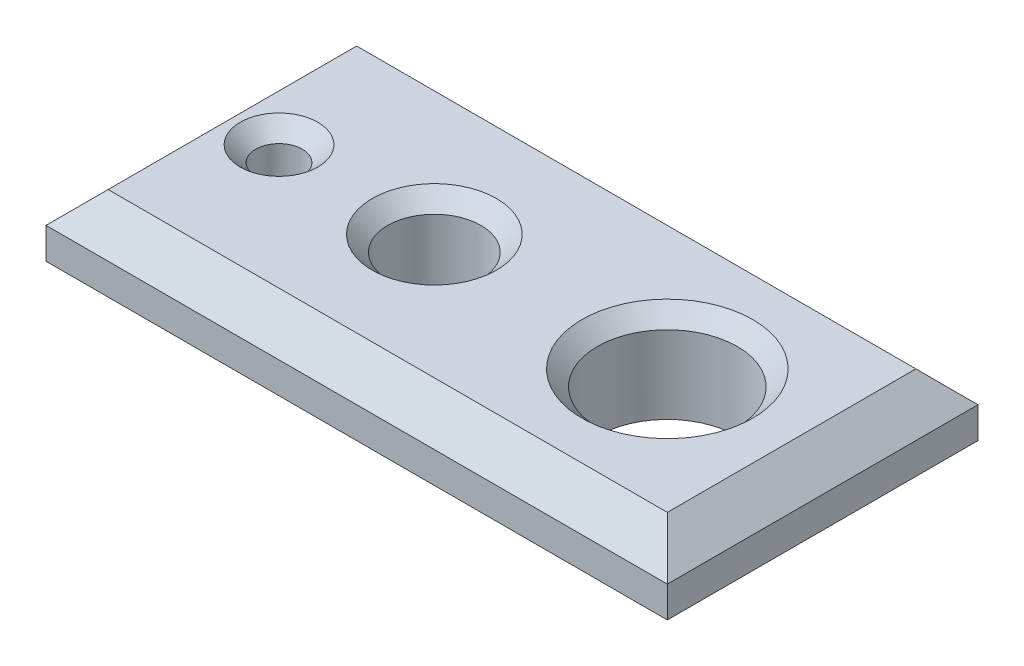
ISO-10303-21;
HEADER;
FILE_DESCRIPTION(('STEP AP214'),'2;1');
FILE_NAME('part.step','',(''),(''),'','','');
FILE_SCHEMA(('AUTOMOTIVE_DESIGN { 1 0 10303 214 1 1 1 1 }'));
ENDSEC;
DATA;
#1=APPLICATION_CONTEXT('core data for automotive mechanical design processes');
#2=APPLICATION_PROTOCOL_DEFINITION('international standard','automotive_design',2000,#1);
#3=PRODUCT_CONTEXT('',#1,'mechanical');
#4=PRODUCT('Part','Part','',(#3));
#5=PRODUCT_RELATED_PRODUCT_CATEGORY('part','',(#4));
#6=PRODUCT_DEFINITION_FORMATION('','',#4);
#7=PRODUCT_DEFINITION_CONTEXT('part definition',#1,'design');
#8=PRODUCT_DEFINITION('design','',#6,#7);
#9=PRODUCT_DEFINITION_SHAPE('','',#8);
#10=(LENGTH_UNIT() NAMED_UNIT(*) SI_UNIT(.MILLI.,.METRE.));
#11=(NAMED_UNIT(*) PLANE_ANGLE_UNIT() SI_UNIT($,.RADIAN.));
#12=(NAMED_UNIT(*) SI_UNIT($,.STERADIAN.) SOLID_ANGLE_UNIT());
#13=UNCERTAINTY_MEASURE_WITH_UNIT(LENGTH_MEASURE(1.E-05),#10,'distance_accuracy_value','');
#14=(GEOMETRIC_REPRESENTATION_CONTEXT(3) GLOBAL_UNCERTAINTY_ASSIGNED_CONTEXT((#13)) GLOBAL_UNIT_ASSIGNED_CONTEXT((#10,
#11,#12)) REPRESENTATION_CONTEXT('',''));
#15=CARTESIAN_POINT('',(0.,0.,0.));
#16=DIRECTION('',(0.,0.,1.));
#17=DIRECTION('',(1.,0.,0.));
#18=AXIS2_PLACEMENT_3D('',#15,#16,#17);
#19=CARTESIAN_POINT('',(0.,30.,0.));
#20=DIRECTION('',(1.,0.,0.));
#21=DIRECTION('',(0.,0.,-1.));
#22=AXIS2_PLACEMENT_3D('',#19,#20,#21);
#23=PLANE('',#22);
#24=DIRECTION('',(0.,-1.,0.));
#25=VECTOR('',#24,1.);
#26=CARTESIAN_POINT('',(0.,30.,-100.));
#27=LINE('',#26,#25);
#28=CARTESIAN_POINT('',(0.,20.,-100.));
#29=VERTEX_POINT('',#28);
#30=CARTESIAN_POINT('',(0.,10.,-100.));
#31=VERTEX_POINT('',#30);
#32=EDGE_CURVE('E134',#29,#31,#27,.T.);
#33=ORIENTED_EDGE('',*,*,#32,.T.);
#34=DIRECTION('',(0.,0.,1.));
#35=VECTOR('',#34,1.);
#36=CARTESIAN_POINT('',(0.,10.,0.));
#37=LINE('',#36,#35);
#38=CARTESIAN_POINT('',(0.,10.,0.));
#39=VERTEX_POINT('',#38);
#40=EDGE_CURVE('E154',#31,#39,#37,.T.);
#41=ORIENTED_EDGE('',*,*,#40,.T.);
#42=DIRECTION('',(0.,-1.,0.));
#43=VECTOR('',#42,1.);
#44=CARTESIAN_POINT('',(0.,30.,0.));
#45=LINE('',#44,#43);
#46=CARTESIAN_POINT('',(0.,20.,0.));
#47=VERTEX_POINT('',#46);
#48=EDGE_CURVE('E117',#47,#39,#45,.T.);
#49=ORIENTED_EDGE('',*,*,#48,.F.);
#50=DIRECTION('',(0.,0.,-1.));
#51=VECTOR('',#50,1.);
#52=CARTESIAN_POINT('',(0.,20.,0.));
#53=LINE('',#52,#51);
#54=EDGE_CURVE('E152',#47,#29,#53,.T.);
#55=ORIENTED_EDGE('',*,*,#54,.T.);
#56=EDGE_LOOP('',(#33,#41,#49,#55));
#57=FACE_BOUND('',#56,.T.);
#58=ADVANCED_FACE('F33',(#57),#23,.F.);
#59=CARTESIAN_POINT('',(0.,30.,0.));
#60=DIRECTION('',(0.,0.,-1.));
#61=DIRECTION('',(-1.,0.,0.));
#62=AXIS2_PLACEMENT_3D('',#59,#60,#61);
#63=PLANE('',#62);
#64=ORIENTED_EDGE('',*,*,#48,.T.);
#65=DIRECTION('',(1.,0.,0.));
#66=VECTOR('',#65,1.);
#67=CARTESIAN_POINT('',(200.,10.,0.));
#68=LINE('',#67,#66);
#69=CARTESIAN_POINT('',(200.,10.,0.));
#70=VERTEX_POINT('',#69);
#71=EDGE_CURVE('E116',#39,#70,#68,.T.);
#72=ORIENTED_EDGE('',*,*,#71,.T.);
#73=DIRECTION('',(0.,-1.,0.));
#74=VECTOR('',#73,1.);
#75=CARTESIAN_POINT('',(200.,30.,0.));
#76=LINE('',#75,#74);
#77=CARTESIAN_POINT('',(200.,20.,0.));
#78=VERTEX_POINT('',#77);
#79=EDGE_CURVE('E123',#78,#70,#76,.T.);
#80=ORIENTED_EDGE('',*,*,#79,.F.);
#81=DIRECTION('',(-1.,0.,0.));
#82=VECTOR('',#81,1.);
#83=CARTESIAN_POINT('',(0.,20.,0.));
#84=LINE('',#83,#82);
#85=EDGE_CURVE('E108',#78,#47,#84,.T.);
#86=ORIENTED_EDGE('',*,*,#85,.T.);
#87=EDGE_LOOP('',(#64,#72,#80,#86));
#88=FACE_BOUND('',#87,.T.);
#89=ADVANCED_FACE('F130',(#88),#63,.F.);
#90=CARTESIAN_POINT('',(200.,30.,0.));
#91=DIRECTION('',(-1.,0.,0.));
#92=DIRECTION('',(0.,0.,1.));
#93=AXIS2_PLACEMENT_3D('',#90,#91,#92);
#94=PLANE('',#93);
#95=ORIENTED_EDGE('',*,*,#79,.T.);
#96=DIRECTION('',(0.,0.,-1.));
#97=VECTOR('',#96,1.);
#98=CARTESIAN_POINT('',(200.,10.,-100.));
#99=LINE('',#98,#97);
#100=CARTESIAN_POINT('',(200.,10.,-100.));
#101=VERTEX_POINT('',#100);
#102=EDGE_CURVE('E126',#70,#101,#99,.T.);
#103=ORIENTED_EDGE('',*,*,#102,.T.);
#104=DIRECTION('',(0.,-1.,0.));
#105=VECTOR('',#104,1.);
#106=CARTESIAN_POINT('',(200.,30.,-100.));
#107=LINE('',#106,#105);
#108=CARTESIAN_POINT('',(200.,20.,-100.));
#109=VERTEX_POINT('',#108);
#110=EDGE_CURVE('E125',#109,#101,#107,.T.);
#111=ORIENTED_EDGE('',*,*,#110,.F.);
#112=DIRECTION('',(0.,0.,1.));
#113=VECTOR('',#112,1.);
#114=CARTESIAN_POINT('',(200.,20.,0.));
#115=LINE('',#114,#113);
#116=EDGE_CURVE('E102',#109,#78,#115,.T.);
#117=ORIENTED_EDGE('',*,*,#116,.T.);
#118=EDGE_LOOP('',(#95,#103,#111,#117));
#119=FACE_BOUND('',#118,.T.);
#120=ADVANCED_FACE('F122',(#119),#94,.F.);
#121=CARTESIAN_POINT('',(0.,30.,-100.));
#122=DIRECTION('',(0.,0.,1.));
#123=DIRECTION('',(1.,0.,0.));
#124=AXIS2_PLACEMENT_3D('',#121,#122,#123);
#125=PLANE('',#124);
#126=ORIENTED_EDGE('',*,*,#110,.T.);
#127=DIRECTION('',(-1.,0.,0.));
#128=VECTOR('',#127,1.);
#129=CARTESIAN_POINT('',(0.,10.,-100.));
#130=LINE('',#129,#128);
#131=EDGE_CURVE('E150',#101,#31,#130,.T.);
#132=ORIENTED_EDGE('',*,*,#131,.T.);
#133=ORIENTED_EDGE('',*,*,#32,.F.);
#134=DIRECTION('',(1.,0.,0.));
#135=VECTOR('',#134,1.);
#136=CARTESIAN_POINT('',(0.,20.,-100.));
#137=LINE('',#136,#135);
#138=EDGE_CURVE('E148',#29,#109,#137,.T.);
#139=ORIENTED_EDGE('',*,*,#138,.T.);
#140=EDGE_LOOP('',(#126,#132,#133,#139));
#141=FACE_BOUND('',#140,.T.);
#142=ADVANCED_FACE('F252',(#141),#125,.F.);
#143=CARTESIAN_POINT('',(0.,30.,0.));
#144=DIRECTION('',(0.,-1.,0.));
#145=DIRECTION('',(0.,0.,-1.));
#146=AXIS2_PLACEMENT_3D('',#143,#144,#145);
#147=PLANE('',#146);
#148=CARTESIAN_POINT('',(150.,30.,-50.));
#149=DIRECTION('',(0.,-1.,0.));
#150=DIRECTION('',(0.,0.,-1.));
#151=AXIS2_PLACEMENT_3D('',#148,#149,#150);
#152=CIRCLE('',#151,27.5000000000001);
#153=CARTESIAN_POINT('',(150.,30.,-77.5000000000001));
#154=VERTEX_POINT('',#153);
#155=EDGE_CURVE('E186',#154,#154,#152,.T.);
#156=ORIENTED_EDGE('',*,*,#155,.T.);
#157=EDGE_LOOP('',(#156));
#158=FACE_BOUND('',#157,.T.);
#159=CARTESIAN_POINT('',(75.,30.,-50.));
#160=DIRECTION('',(0.,-1.,0.));
#161=DIRECTION('',(0.,0.,-1.));
#162=AXIS2_PLACEMENT_3D('',#159,#160,#161);
#163=CIRCLE('',#162,20.);
#164=CARTESIAN_POINT('',(75.,30.,-70.));
#165=VERTEX_POINT('',#164);
#166=EDGE_CURVE('E183',#165,#165,#163,.T.);
#167=ORIENTED_EDGE('',*,*,#166,.T.);
#168=EDGE_LOOP('',(#167));
#169=FACE_BOUND('',#168,.T.);
#170=CARTESIAN_POINT('',(25.,30.,-50.));
#171=DIRECTION('',(0.,-1.,0.));
#172=DIRECTION('',(0.,0.,-1.));
#173=AXIS2_PLACEMENT_3D('',#170,#171,#172);
#174=CIRCLE('',#173,12.5);
#175=CARTESIAN_POINT('',(25.,30.,-62.5));
#176=VERTEX_POINT('',#175);
#177=EDGE_CURVE('E180',#176,#176,#174,.T.);
#178=ORIENTED_EDGE('',*,*,#177,.T.);
#179=EDGE_LOOP('',(#178));
#180=FACE_BOUND('',#179,.T.);
#181=DIRECTION('',(1.,0.,0.));
#182=VECTOR('',#181,1.);
#183=CARTESIAN_POINT('',(0.,30.,-10.));
#184=LINE('',#183,#182);
#185=CARTESIAN_POINT('',(10.,30.,-10.));
#186=VERTEX_POINT('',#185);
#187=CARTESIAN_POINT('',(190.,30.,-10.));
#188=VERTEX_POINT('',#187);
#189=EDGE_CURVE('E48',#186,#188,#184,.T.);
#190=ORIENTED_EDGE('',*,*,#189,.T.);
#191=DIRECTION('',(0.,0.,-1.));
#192=VECTOR('',#191,1.);
#193=CARTESIAN_POINT('',(190.,30.,0.));
#194=LINE('',#193,#192);
#195=CARTESIAN_POINT('',(190.,30.,-90.));
#196=VERTEX_POINT('',#195);
#197=EDGE_CURVE('E103',#188,#196,#194,.T.);
#198=ORIENTED_EDGE('',*,*,#197,.T.);
#199=DIRECTION('',(-1.,0.,0.));
#200=VECTOR('',#199,1.);
#201=CARTESIAN_POINT('',(0.,30.,-90.));
#202=LINE('',#201,#200);
#203=CARTESIAN_POINT('',(10.,30.,-90.));
#204=VERTEX_POINT('',#203);
#205=EDGE_CURVE('E158',#196,#204,#202,.T.);
#206=ORIENTED_EDGE('',*,*,#205,.T.);
#207=DIRECTION('',(0.,0.,1.));
#208=VECTOR('',#207,1.);
#209=CARTESIAN_POINT('',(10.,30.,0.));
#210=LINE('',#209,#208);
#211=EDGE_CURVE('E156',#204,#186,#210,.T.);
#212=ORIENTED_EDGE('',*,*,#211,.T.);
#213=EDGE_LOOP('',(#190,#198,#206,#212));
#214=FACE_BOUND('',#213,.T.);
#215=ADVANCED_FACE('F279',(#158,#169,#180,#214),#147,.F.);
#216=CARTESIAN_POINT('',(0.,0.,0.));
#217=DIRECTION('',(0.,-1.,0.));
#218=DIRECTION('',(0.,0.,-1.));
#219=AXIS2_PLACEMENT_3D('',#216,#217,#218);
#220=PLANE('',#219);
#221=DIRECTION('',(0.,0.,1.));
#222=VECTOR('',#221,1.);
#223=CARTESIAN_POINT('',(190.,0.,0.));
#224=LINE('',#223,#222);
#225=CARTESIAN_POINT('',(190.,0.,-90.));
#226=VERTEX_POINT('',#225);
#227=CARTESIAN_POINT('',(190.,0.,-10.));
#228=VERTEX_POINT('',#227);
#229=EDGE_CURVE('E143',#226,#228,#224,.T.);
#230=ORIENTED_EDGE('',*,*,#229,.T.);
#231=DIRECTION('',(-1.,0.,0.));
#232=VECTOR('',#231,1.);
#233=CARTESIAN_POINT('',(0.,0.,-10.));
#234=LINE('',#233,#232);
#235=CARTESIAN_POINT('',(10.,0.,-10.));
#236=VERTEX_POINT('',#235);
#237=EDGE_CURVE('E127',#228,#236,#234,.T.);
#238=ORIENTED_EDGE('',*,*,#237,.T.);
#239=DIRECTION('',(0.,0.,-1.));
#240=VECTOR('',#239,1.);
#241=CARTESIAN_POINT('',(10.,0.,-100.));
#242=LINE('',#241,#240);
#243=CARTESIAN_POINT('',(10.,0.,-90.));
#244=VERTEX_POINT('',#243);
#245=EDGE_CURVE('E139',#236,#244,#242,.T.);
#246=ORIENTED_EDGE('',*,*,#245,.T.);
#247=DIRECTION('',(1.,0.,0.));
#248=VECTOR('',#247,1.);
#249=CARTESIAN_POINT('',(200.,0.,-90.));
#250=LINE('',#249,#248);
#251=EDGE_CURVE('E141',#244,#226,#250,.T.);
#252=ORIENTED_EDGE('',*,*,#251,.T.);
#253=EDGE_LOOP('',(#230,#238,#246,#252));
#254=FACE_BOUND('',#253,.T.);
#255=CARTESIAN_POINT('',(25.,0.,-50.));
#256=DIRECTION('',(0.,1.,0.));
#257=DIRECTION('',(0.,0.,1.));
#258=AXIS2_PLACEMENT_3D('',#255,#256,#257);
#259=CIRCLE('',#258,7.5);
#260=CARTESIAN_POINT('',(25.,0.,-42.5));
#261=VERTEX_POINT('',#260);
#262=EDGE_CURVE('E255',#261,#261,#259,.T.);
#263=ORIENTED_EDGE('',*,*,#262,.T.);
#264=EDGE_LOOP('',(#263));
#265=FACE_BOUND('',#264,.T.);
#266=CARTESIAN_POINT('',(75.,0.,-50.));
#267=DIRECTION('',(0.,1.,0.));
#268=DIRECTION('',(0.,0.,1.));
#269=AXIS2_PLACEMENT_3D('',#266,#267,#268);
#270=CIRCLE('',#269,15.);
#271=CARTESIAN_POINT('',(75.,0.,-35.));
#272=VERTEX_POINT('',#271);
#273=EDGE_CURVE('E257',#272,#272,#270,.T.);
#274=ORIENTED_EDGE('',*,*,#273,.T.);
#275=EDGE_LOOP('',(#274));
#276=FACE_BOUND('',#275,.T.);
#277=CARTESIAN_POINT('',(150.,0.,-50.));
#278=DIRECTION('',(0.,1.,0.));
#279=DIRECTION('',(0.,0.,1.));
#280=AXIS2_PLACEMENT_3D('',#277,#278,#279);
#281=CIRCLE('',#280,22.5);
#282=CARTESIAN_POINT('',(150.,0.,-27.5));
#283=VERTEX_POINT('',#282);
#284=EDGE_CURVE('E173',#283,#283,#281,.T.);
#285=ORIENTED_EDGE('',*,*,#284,.T.);
#286=EDGE_LOOP('',(#285));
#287=FACE_BOUND('',#286,.T.);
#288=ADVANCED_FACE('F265',(#254,#265,#276,#287),#220,.T.);
#289=CARTESIAN_POINT('',(150.,0.,-50.));
#290=DIRECTION('',(0.,1.,0.));
#291=DIRECTION('',(0.,0.,1.));
#292=AXIS2_PLACEMENT_3D('',#289,#290,#291);
#293=CYLINDRICAL_SURFACE('',#292,22.5);
#294=CARTESIAN_POINT('',(150.,24.9999999999999,-50.));
#295=DIRECTION('',(0.,-1.,0.));
#296=DIRECTION('',(0.,0.,-1.));
#297=AXIS2_PLACEMENT_3D('',#294,#295,#296);
#298=CIRCLE('',#297,22.5);
#299=CARTESIAN_POINT('',(150.,24.9999999999999,-72.5));
#300=VERTEX_POINT('',#299);
#301=EDGE_CURVE('E162',#300,#300,#298,.F.);
#302=ORIENTED_EDGE('',*,*,#301,.T.);
#303=EDGE_LOOP('',(#302));
#304=FACE_BOUND('',#303,.T.);
#305=ORIENTED_EDGE('',*,*,#284,.F.);
#306=EDGE_LOOP('',(#305));
#307=FACE_BOUND('',#306,.T.);
#308=ADVANCED_FACE('F268',(#304,#307),#293,.F.);
#309=CARTESIAN_POINT('',(75.,0.,-50.));
#310=DIRECTION('',(0.,1.,0.));
#311=DIRECTION('',(0.,0.,1.));
#312=AXIS2_PLACEMENT_3D('',#309,#310,#311);
#313=CYLINDRICAL_SURFACE('',#312,15.);
#314=CARTESIAN_POINT('',(75.,25.,-50.));
#315=DIRECTION('',(0.,-1.,0.));
#316=DIRECTION('',(0.,0.,-1.));
#317=AXIS2_PLACEMENT_3D('',#314,#315,#316);
#318=CIRCLE('',#317,15.);
#319=CARTESIAN_POINT('',(75.,25.,-65.));
#320=VERTEX_POINT('',#319);
#321=EDGE_CURVE('E41',#320,#320,#318,.F.);
#322=ORIENTED_EDGE('',*,*,#321,.T.);
#323=EDGE_LOOP('',(#322));
#324=FACE_BOUND('',#323,.T.);
#325=ORIENTED_EDGE('',*,*,#273,.F.);
#326=EDGE_LOOP('',(#325));
#327=FACE_BOUND('',#326,.T.);
#328=ADVANCED_FACE('F191',(#324,#327),#313,.F.);
#329=CARTESIAN_POINT('',(25.,0.,-50.));
#330=DIRECTION('',(0.,1.,0.));
#331=DIRECTION('',(0.,0.,1.));
#332=AXIS2_PLACEMENT_3D('',#329,#330,#331);
#333=CYLINDRICAL_SURFACE('',#332,7.5);
#334=CARTESIAN_POINT('',(25.,25.,-50.));
#335=DIRECTION('',(0.,-1.,0.));
#336=DIRECTION('',(0.,0.,-1.));
#337=AXIS2_PLACEMENT_3D('',#334,#335,#336);
#338=CIRCLE('',#337,7.5);
#339=CARTESIAN_POINT('',(25.,25.,-57.5));
#340=VERTEX_POINT('',#339);
#341=EDGE_CURVE('E11',#340,#340,#338,.F.);
#342=ORIENTED_EDGE('',*,*,#341,.T.);
#343=EDGE_LOOP('',(#342));
#344=FACE_BOUND('',#343,.T.);
#345=ORIENTED_EDGE('',*,*,#262,.F.);
#346=EDGE_LOOP('',(#345));
#347=FACE_BOUND('',#346,.T.);
#348=ADVANCED_FACE('F232',(#344,#347),#333,.F.);
#349=CARTESIAN_POINT('',(0.,10.,-100.));
#350=DIRECTION('',(0.,-0.707106781186549,-0.707106781186547));
#351=DIRECTION('',(1.,0.,0.));
#352=AXIS2_PLACEMENT_3D('',#349,#350,#351);
#353=PLANE('',#352);
#354=DIRECTION('',(-0.577350269189626,-0.577350269189625,0.577350269189626));
#355=VECTOR('',#354,1.);
#356=CARTESIAN_POINT('',(133.333333333333,-56.6666666666666,-33.3333333333332));
#357=LINE('',#356,#355);
#358=EDGE_CURVE('E167',#226,#101,#357,.F.);
#359=ORIENTED_EDGE('',*,*,#358,.F.);
#360=ORIENTED_EDGE('',*,*,#251,.F.);
#361=DIRECTION('',(0.577350269189626,-0.577350269189625,0.577350269189626));
#362=VECTOR('',#361,1.);
#363=CARTESIAN_POINT('',(33.3333333333334,-23.3333333333333,-66.6666666666666));
#364=LINE('',#363,#362);
#365=EDGE_CURVE('E170',#31,#244,#364,.T.);
#366=ORIENTED_EDGE('',*,*,#365,.F.);
#367=ORIENTED_EDGE('',*,*,#131,.F.);
#368=EDGE_LOOP('',(#359,#360,#366,#367));
#369=FACE_BOUND('',#368,.T.);
#370=ADVANCED_FACE('F228',(#369),#353,.T.);
#371=CARTESIAN_POINT('',(0.,10.,0.));
#372=DIRECTION('',(-0.707106781186547,-0.707106781186549,0.));
#373=DIRECTION('',(0.,0.,-1.));
#374=AXIS2_PLACEMENT_3D('',#371,#372,#373);
#375=PLANE('',#374);
#376=ORIENTED_EDGE('',*,*,#365,.T.);
#377=ORIENTED_EDGE('',*,*,#245,.F.);
#378=DIRECTION('',(-0.577350269189626,0.577350269189625,0.577350269189626));
#379=VECTOR('',#378,1.);
#380=CARTESIAN_POINT('',(0.,10.,0.));
#381=LINE('',#380,#379);
#382=EDGE_CURVE('E165',#39,#236,#381,.F.);
#383=ORIENTED_EDGE('',*,*,#382,.F.);
#384=ORIENTED_EDGE('',*,*,#40,.F.);
#385=EDGE_LOOP('',(#376,#377,#383,#384));
#386=FACE_BOUND('',#385,.T.);
#387=ADVANCED_FACE('F224',(#386),#375,.T.);
#388=CARTESIAN_POINT('',(200.,10.,0.));
#389=DIRECTION('',(0.707106781186547,-0.707106781186549,0.));
#390=DIRECTION('',(0.,0.,1.));
#391=AXIS2_PLACEMENT_3D('',#388,#389,#390);
#392=PLANE('',#391);
#393=ORIENTED_EDGE('',*,*,#358,.T.);
#394=ORIENTED_EDGE('',*,*,#102,.F.);
#395=DIRECTION('',(-0.577350269189626,-0.577350269189625,-0.577350269189626));
#396=VECTOR('',#395,1.);
#397=CARTESIAN_POINT('',(200.,10.,0.));
#398=LINE('',#397,#396);
#399=EDGE_CURVE('E163',#228,#70,#398,.F.);
#400=ORIENTED_EDGE('',*,*,#399,.F.);
#401=ORIENTED_EDGE('',*,*,#229,.F.);
#402=EDGE_LOOP('',(#393,#394,#400,#401));
#403=FACE_BOUND('',#402,.T.);
#404=ADVANCED_FACE('F220',(#403),#392,.T.);
#405=CARTESIAN_POINT('',(0.,10.,0.));
#406=DIRECTION('',(0.,-0.707106781186549,0.707106781186547));
#407=DIRECTION('',(-1.,0.,0.));
#408=AXIS2_PLACEMENT_3D('',#405,#406,#407);
#409=PLANE('',#408);
#410=ORIENTED_EDGE('',*,*,#382,.T.);
#411=ORIENTED_EDGE('',*,*,#237,.F.);
#412=ORIENTED_EDGE('',*,*,#399,.T.);
#413=ORIENTED_EDGE('',*,*,#71,.F.);
#414=EDGE_LOOP('',(#410,#411,#412,#413));
#415=FACE_BOUND('',#414,.T.);
#416=ADVANCED_FACE('F216',(#415),#409,.T.);
#417=CARTESIAN_POINT('',(10.,30.,0.));
#418=DIRECTION('',(0.707106781186549,-0.707106781186547,0.));
#419=DIRECTION('',(0.,0.,1.));
#420=AXIS2_PLACEMENT_3D('',#417,#418,#419);
#421=PLANE('',#420);
#422=DIRECTION('',(-0.577350269189625,-0.577350269189627,-0.577350269189625));
#423=VECTOR('',#422,1.);
#424=CARTESIAN_POINT('',(40.,60.,-60.));
#425=LINE('',#424,#423);
#426=EDGE_CURVE('E105',#29,#204,#425,.F.);
#427=ORIENTED_EDGE('',*,*,#426,.F.);
#428=ORIENTED_EDGE('',*,*,#54,.F.);
#429=DIRECTION('',(0.577350269189625,0.577350269189627,-0.577350269189625));
#430=VECTOR('',#429,1.);
#431=CARTESIAN_POINT('',(6.66666666666668,26.6666666666667,-6.66666666666668));
#432=LINE('',#431,#430);
#433=EDGE_CURVE('E111',#186,#47,#432,.F.);
#434=ORIENTED_EDGE('',*,*,#433,.F.);
#435=ORIENTED_EDGE('',*,*,#211,.F.);
#436=EDGE_LOOP('',(#427,#428,#434,#435));
#437=FACE_BOUND('',#436,.T.);
#438=ADVANCED_FACE('F219',(#437),#421,.F.);
#439=CARTESIAN_POINT('',(0.,30.,-10.));
#440=DIRECTION('',(0.,-0.707106781186547,-0.707106781186549));
#441=DIRECTION('',(1.,0.,0.));
#442=AXIS2_PLACEMENT_3D('',#439,#440,#441);
#443=PLANE('',#442);
#444=ORIENTED_EDGE('',*,*,#433,.T.);
#445=ORIENTED_EDGE('',*,*,#85,.F.);
#446=DIRECTION('',(-0.577350269189625,0.577350269189627,-0.577350269189625));
#447=VECTOR('',#446,1.);
#448=CARTESIAN_POINT('',(126.666666666667,93.3333333333334,-73.3333333333332));
#449=LINE('',#448,#447);
#450=EDGE_CURVE('E98',#188,#78,#449,.F.);
#451=ORIENTED_EDGE('',*,*,#450,.F.);
#452=ORIENTED_EDGE('',*,*,#189,.F.);
#453=EDGE_LOOP('',(#444,#445,#451,#452));
#454=FACE_BOUND('',#453,.T.);
#455=ADVANCED_FACE('F109',(#454),#443,.F.);
#456=CARTESIAN_POINT('',(0.,30.,-90.));
#457=DIRECTION('',(0.,-0.707106781186547,0.707106781186549));
#458=DIRECTION('',(-1.,0.,0.));
#459=AXIS2_PLACEMENT_3D('',#456,#457,#458);
#460=PLANE('',#459);
#461=ORIENTED_EDGE('',*,*,#426,.T.);
#462=ORIENTED_EDGE('',*,*,#205,.F.);
#463=DIRECTION('',(0.577350269189625,-0.577350269189627,-0.577350269189625));
#464=VECTOR('',#463,1.);
#465=CARTESIAN_POINT('',(126.666666666667,93.3333333333334,-26.6666666666668));
#466=LINE('',#465,#464);
#467=EDGE_CURVE('E56',#109,#196,#466,.F.);
#468=ORIENTED_EDGE('',*,*,#467,.F.);
#469=ORIENTED_EDGE('',*,*,#138,.F.);
#470=EDGE_LOOP('',(#461,#462,#468,#469));
#471=FACE_BOUND('',#470,.T.);
#472=ADVANCED_FACE('F236',(#471),#460,.F.);
#473=CARTESIAN_POINT('',(190.,30.,0.));
#474=DIRECTION('',(-0.707106781186549,-0.707106781186547,0.));
#475=DIRECTION('',(0.,0.,-1.));
#476=AXIS2_PLACEMENT_3D('',#473,#474,#475);
#477=PLANE('',#476);
#478=ORIENTED_EDGE('',*,*,#450,.T.);
#479=ORIENTED_EDGE('',*,*,#116,.F.);
#480=ORIENTED_EDGE('',*,*,#467,.T.);
#481=ORIENTED_EDGE('',*,*,#197,.F.);
#482=EDGE_LOOP('',(#478,#479,#480,#481));
#483=FACE_BOUND('',#482,.T.);
#484=ADVANCED_FACE('F100',(#483),#477,.F.);
#485=CARTESIAN_POINT('',(150.,24.9999999999999,-50.));
#486=DIRECTION('',(0.,1.,0.));
#487=DIRECTION('',(0.,0.,1.));
#488=AXIS2_PLACEMENT_3D('',#485,#486,#487);
#489=CONICAL_SURFACE('',#488,22.5,0.785398163397449);
#490=ORIENTED_EDGE('',*,*,#155,.F.);
#491=EDGE_LOOP('',(#490));
#492=FACE_BOUND('',#491,.T.);
#493=ORIENTED_EDGE('',*,*,#301,.F.);
#494=EDGE_LOOP('',(#493));
#495=FACE_BOUND('',#494,.T.);
#496=ADVANCED_FACE('F196',(#492,#495),#489,.F.);
#497=CARTESIAN_POINT('',(75.,25.,-50.));
#498=DIRECTION('',(0.,1.,0.));
#499=DIRECTION('',(0.,0.,1.));
#500=AXIS2_PLACEMENT_3D('',#497,#498,#499);
#501=CONICAL_SURFACE('',#500,15.,0.785398163397449);
#502=ORIENTED_EDGE('',*,*,#166,.F.);
#503=EDGE_LOOP('',(#502));
#504=FACE_BOUND('',#503,.T.);
#505=ORIENTED_EDGE('',*,*,#321,.F.);
#506=EDGE_LOOP('',(#505));
#507=FACE_BOUND('',#506,.T.);
#508=ADVANCED_FACE('F194',(#504,#507),#501,.F.);
#509=CARTESIAN_POINT('',(25.,25.,-50.));
#510=DIRECTION('',(0.,1.,0.));
#511=DIRECTION('',(0.,0.,1.));
#512=AXIS2_PLACEMENT_3D('',#509,#510,#511);
#513=CONICAL_SURFACE('',#512,7.5,0.785398163397448);
#514=ORIENTED_EDGE('',*,*,#177,.F.);
#515=EDGE_LOOP('',(#514));
#516=FACE_BOUND('',#515,.T.);
#517=ORIENTED_EDGE('',*,*,#341,.F.);
#518=EDGE_LOOP('',(#517));
#519=FACE_BOUND('',#518,.T.);
#520=ADVANCED_FACE('F35',(#516,#519),#513,.F.);
#521=CLOSED_SHELL('',(#58,#89,#120,#142,#215,#288,#308,#328,#348,#370,#387,#404,#416,#438,#455,
#472,#484,#496,#508,#520));
#522=MANIFOLD_SOLID_BREP('B2',#521);
#523=ADVANCED_BREP_SHAPE_REPRESENTATION('',(#18,#522),#14);
#524=SHAPE_DEFINITION_REPRESENTATION(#9,#523);
ENDSEC;
END-ISO-10303-21;
